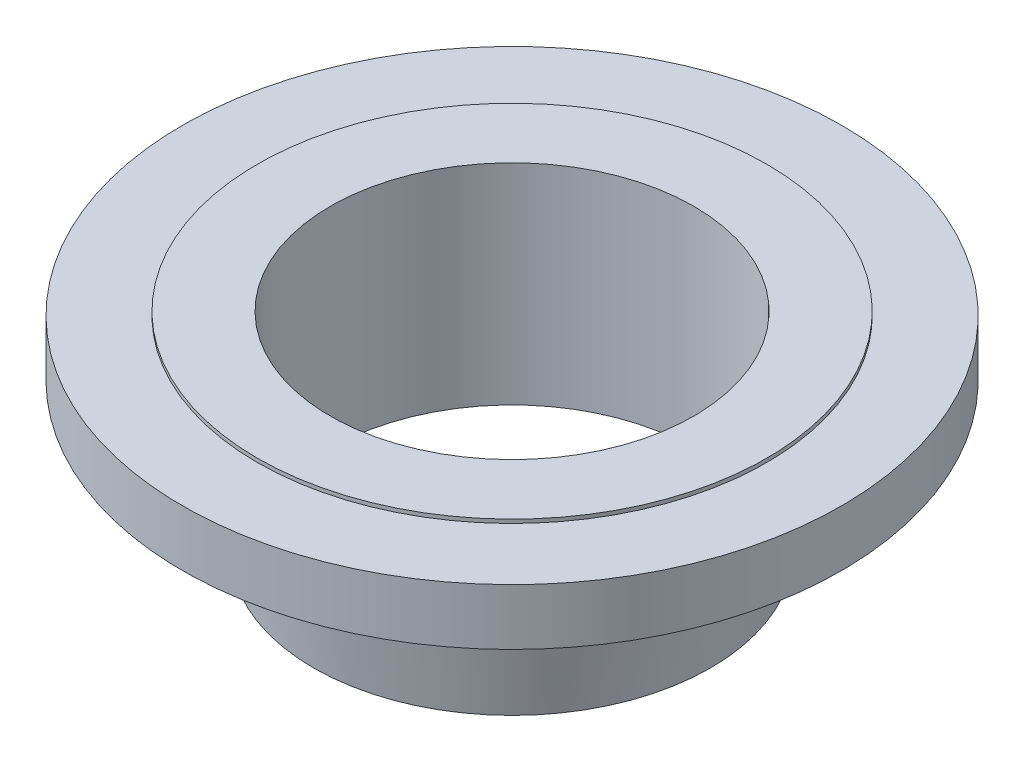
ISO-10303-21;
HEADER;
FILE_DESCRIPTION(('STEP AP214'),'2;1');
FILE_NAME('part.step','',(''),(''),'','','');
FILE_SCHEMA(('AUTOMOTIVE_DESIGN { 1 0 10303 214 1 1 1 1 }'));
ENDSEC;
DATA;
#1=APPLICATION_CONTEXT('core data for automotive mechanical design processes');
#2=APPLICATION_PROTOCOL_DEFINITION('international standard','automotive_design',2000,#1);
#3=PRODUCT_CONTEXT('',#1,'mechanical');
#4=PRODUCT('Part','Part','',(#3));
#5=PRODUCT_RELATED_PRODUCT_CATEGORY('part','',(#4));
#6=PRODUCT_DEFINITION_FORMATION('','',#4);
#7=PRODUCT_DEFINITION_CONTEXT('part definition',#1,'design');
#8=PRODUCT_DEFINITION('design','',#6,#7);
#9=PRODUCT_DEFINITION_SHAPE('','',#8);
#10=(LENGTH_UNIT() NAMED_UNIT(*) SI_UNIT(.MILLI.,.METRE.));
#11=(NAMED_UNIT(*) PLANE_ANGLE_UNIT() SI_UNIT($,.RADIAN.));
#12=(NAMED_UNIT(*) SI_UNIT($,.STERADIAN.) SOLID_ANGLE_UNIT());
#13=UNCERTAINTY_MEASURE_WITH_UNIT(LENGTH_MEASURE(1.E-05),#10,'distance_accuracy_value','');
#14=(GEOMETRIC_REPRESENTATION_CONTEXT(3) GLOBAL_UNCERTAINTY_ASSIGNED_CONTEXT((#13)) GLOBAL_UNIT_ASSIGNED_CONTEXT((#10,
#11,#12)) REPRESENTATION_CONTEXT('',''));
#15=CARTESIAN_POINT('',(0.,0.,0.));
#16=DIRECTION('',(0.,0.,1.));
#17=DIRECTION('',(1.,0.,0.));
#18=AXIS2_PLACEMENT_3D('',#15,#16,#17);
#19=CARTESIAN_POINT('',(0.,0.,-84.15));
#20=DIRECTION('',(0.,-1.,0.));
#21=DIRECTION('',(0.,0.,-1.));
#22=AXIS2_PLACEMENT_3D('',#19,#20,#21);
#23=PLANE('',#22);
#24=CARTESIAN_POINT('',(0.,0.,0.));
#25=DIRECTION('',(0.,-1.,0.));
#26=DIRECTION('',(0.,0.,-1.));
#27=AXIS2_PLACEMENT_3D('',#24,#25,#26);
#28=CIRCLE('',#27,84.15);
#29=CARTESIAN_POINT('',(0.,0.,-84.15));
#30=VERTEX_POINT('',#29);
#31=EDGE_CURVE('E65',#30,#30,#28,.T.);
#32=ORIENTED_EDGE('',*,*,#31,.T.);
#33=EDGE_LOOP('',(#32));
#34=FACE_BOUND('',#33,.T.);
#35=CARTESIAN_POINT('',(0.,0.,0.));
#36=DIRECTION('',(0.,-1.,0.));
#37=DIRECTION('',(0.,0.,-1.));
#38=AXIS2_PLACEMENT_3D('',#35,#36,#37);
#39=CIRCLE('',#38,77.05);
#40=CARTESIAN_POINT('',(0.,0.,-77.05));
#41=VERTEX_POINT('',#40);
#42=EDGE_CURVE('E10',#41,#41,#39,.T.);
#43=ORIENTED_EDGE('',*,*,#42,.F.);
#44=EDGE_LOOP('',(#43));
#45=FACE_BOUND('',#44,.T.);
#46=ADVANCED_FACE('F37',(#34,#45),#23,.T.);
#47=CARTESIAN_POINT('',(0.,-50.,0.));
#48=DIRECTION('',(0.,-1.,0.));
#49=DIRECTION('',(0.,0.,-1.));
#50=AXIS2_PLACEMENT_3D('',#47,#48,#49);
#51=CYLINDRICAL_SURFACE('',#50,77.05);
#52=ORIENTED_EDGE('',*,*,#42,.T.);
#53=EDGE_LOOP('',(#52));
#54=FACE_BOUND('',#53,.T.);
#55=CARTESIAN_POINT('',(0.,88.9,0.));
#56=DIRECTION('',(0.,-1.,0.));
#57=DIRECTION('',(0.,0.,-1.));
#58=AXIS2_PLACEMENT_3D('',#55,#56,#57);
#59=CIRCLE('',#58,77.05);
#60=CARTESIAN_POINT('',(0.,88.9,-77.05));
#61=VERTEX_POINT('',#60);
#62=EDGE_CURVE('E43',#61,#61,#59,.T.);
#63=ORIENTED_EDGE('',*,*,#62,.F.);
#64=EDGE_LOOP('',(#63));
#65=FACE_BOUND('',#64,.T.);
#66=ADVANCED_FACE('F83',(#54,#65),#51,.F.);
#67=CARTESIAN_POINT('',(0.,88.9,-77.05));
#68=DIRECTION('',(0.,1.,0.));
#69=DIRECTION('',(0.,0.,1.));
#70=AXIS2_PLACEMENT_3D('',#67,#68,#69);
#71=PLANE('',#70);
#72=ORIENTED_EDGE('',*,*,#62,.T.);
#73=EDGE_LOOP('',(#72));
#74=FACE_BOUND('',#73,.T.);
#75=CARTESIAN_POINT('',(0.,88.9,0.));
#76=DIRECTION('',(0.,-1.,0.));
#77=DIRECTION('',(0.,0.,-1.));
#78=AXIS2_PLACEMENT_3D('',#75,#76,#77);
#79=CIRCLE('',#78,107.95);
#80=CARTESIAN_POINT('',(0.,88.9,-107.95));
#81=VERTEX_POINT('',#80);
#82=EDGE_CURVE('E47',#81,#81,#79,.T.);
#83=ORIENTED_EDGE('',*,*,#82,.F.);
#84=EDGE_LOOP('',(#83));
#85=FACE_BOUND('',#84,.T.);
#86=ADVANCED_FACE('F87',(#74,#85),#71,.T.);
#87=CARTESIAN_POINT('',(0.,-50.,0.));
#88=DIRECTION('',(0.,-1.,0.));
#89=DIRECTION('',(0.,0.,-1.));
#90=AXIS2_PLACEMENT_3D('',#87,#88,#89);
#91=CYLINDRICAL_SURFACE('',#90,107.95);
#92=ORIENTED_EDGE('',*,*,#82,.T.);
#93=EDGE_LOOP('',(#92));
#94=FACE_BOUND('',#93,.T.);
#95=CARTESIAN_POINT('',(0.,87.3,0.));
#96=DIRECTION('',(0.,-1.,0.));
#97=DIRECTION('',(0.,0.,-1.));
#98=AXIS2_PLACEMENT_3D('',#95,#96,#97);
#99=CIRCLE('',#98,107.95);
#100=CARTESIAN_POINT('',(0.,87.3,-107.95));
#101=VERTEX_POINT('',#100);
#102=EDGE_CURVE('E51',#101,#101,#99,.T.);
#103=ORIENTED_EDGE('',*,*,#102,.F.);
#104=EDGE_LOOP('',(#103));
#105=FACE_BOUND('',#104,.T.);
#106=ADVANCED_FACE('F91',(#94,#105),#91,.T.);
#107=CARTESIAN_POINT('',(0.,87.3,-107.95));
#108=DIRECTION('',(0.,1.,0.));
#109=DIRECTION('',(0.,0.,1.));
#110=AXIS2_PLACEMENT_3D('',#107,#108,#109);
#111=PLANE('',#110);
#112=ORIENTED_EDGE('',*,*,#102,.T.);
#113=EDGE_LOOP('',(#112));
#114=FACE_BOUND('',#113,.T.);
#115=CARTESIAN_POINT('',(0.,87.3,0.));
#116=DIRECTION('',(0.,-1.,0.));
#117=DIRECTION('',(0.,0.,-1.));
#118=AXIS2_PLACEMENT_3D('',#115,#116,#117);
#119=CIRCLE('',#118,139.7);
#120=CARTESIAN_POINT('',(0.,87.3,-139.7));
#121=VERTEX_POINT('',#120);
#122=EDGE_CURVE('E56',#121,#121,#119,.T.);
#123=ORIENTED_EDGE('',*,*,#122,.F.);
#124=EDGE_LOOP('',(#123));
#125=FACE_BOUND('',#124,.T.);
#126=ADVANCED_FACE('F97',(#114,#125),#111,.T.);
#127=CARTESIAN_POINT('',(0.,-50.,0.));
#128=DIRECTION('',(0.,-1.,0.));
#129=DIRECTION('',(0.,0.,-1.));
#130=AXIS2_PLACEMENT_3D('',#127,#128,#129);
#131=CYLINDRICAL_SURFACE('',#130,139.7);
#132=ORIENTED_EDGE('',*,*,#122,.T.);
#133=EDGE_LOOP('',(#132));
#134=FACE_BOUND('',#133,.T.);
#135=CARTESIAN_POINT('',(0.,63.5,0.));
#136=DIRECTION('',(0.,-1.,0.));
#137=DIRECTION('',(0.,0.,-1.));
#138=AXIS2_PLACEMENT_3D('',#135,#136,#137);
#139=CIRCLE('',#138,139.7);
#140=CARTESIAN_POINT('',(0.,63.5,-139.7));
#141=VERTEX_POINT('',#140);
#142=EDGE_CURVE('E59',#141,#141,#139,.T.);
#143=ORIENTED_EDGE('',*,*,#142,.F.);
#144=EDGE_LOOP('',(#143));
#145=FACE_BOUND('',#144,.T.);
#146=ADVANCED_FACE('F79',(#134,#145),#131,.T.);
#147=CARTESIAN_POINT('',(0.,63.5,-139.7));
#148=DIRECTION('',(0.,-1.,0.));
#149=DIRECTION('',(0.,0.,-1.));
#150=AXIS2_PLACEMENT_3D('',#147,#148,#149);
#151=PLANE('',#150);
#152=ORIENTED_EDGE('',*,*,#142,.T.);
#153=EDGE_LOOP('',(#152));
#154=FACE_BOUND('',#153,.T.);
#155=CARTESIAN_POINT('',(0.,63.5,0.));
#156=DIRECTION('',(0.,-1.,0.));
#157=DIRECTION('',(0.,0.,-1.));
#158=AXIS2_PLACEMENT_3D('',#155,#156,#157);
#159=CIRCLE('',#158,92.1);
#160=CARTESIAN_POINT('',(0.,63.5,-92.1));
#161=VERTEX_POINT('',#160);
#162=EDGE_CURVE('E62',#161,#161,#159,.T.);
#163=ORIENTED_EDGE('',*,*,#162,.F.);
#164=EDGE_LOOP('',(#163));
#165=FACE_BOUND('',#164,.T.);
#166=ADVANCED_FACE('F73',(#154,#165),#151,.T.);
#167=CARTESIAN_POINT('',(0.,0.,0.));
#168=DIRECTION('',(0.,1.,0.));
#169=DIRECTION('',(0.,0.,1.));
#170=AXIS2_PLACEMENT_3D('',#167,#168,#169);
#171=CONICAL_SURFACE('',#170,84.15,0.124548811774686);
#172=ORIENTED_EDGE('',*,*,#162,.T.);
#173=EDGE_LOOP('',(#172));
#174=FACE_BOUND('',#173,.T.);
#175=ORIENTED_EDGE('',*,*,#31,.F.);
#176=EDGE_LOOP('',(#175));
#177=FACE_BOUND('',#176,.T.);
#178=ADVANCED_FACE('F71',(#174,#177),#171,.T.);
#179=CLOSED_SHELL('',(#46,#66,#86,#106,#126,#146,#166,#178));
#180=MANIFOLD_SOLID_BREP('B2',#179);
#181=ADVANCED_BREP_SHAPE_REPRESENTATION('',(#18,#180),#14);
#182=SHAPE_DEFINITION_REPRESENTATION(#9,#181);
ENDSEC;
END-ISO-10303-21;
